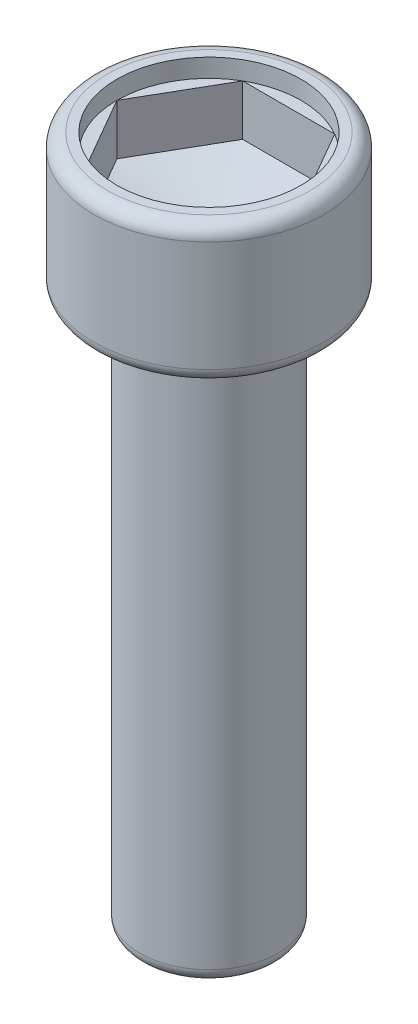
ISO-10303-21;
HEADER;
FILE_DESCRIPTION(('STEP AP214'),'2;1');
FILE_NAME('part.step','',(''),(''),'','','');
FILE_SCHEMA(('AUTOMOTIVE_DESIGN { 1 0 10303 214 1 1 1 1 }'));
ENDSEC;
DATA;
#1=APPLICATION_CONTEXT('core data for automotive mechanical design processes');
#2=APPLICATION_PROTOCOL_DEFINITION('international standard','automotive_design',2000,#1);
#3=PRODUCT_CONTEXT('',#1,'mechanical');
#4=PRODUCT('Part','Part','',(#3));
#5=PRODUCT_RELATED_PRODUCT_CATEGORY('part','',(#4));
#6=PRODUCT_DEFINITION_FORMATION('','',#4);
#7=PRODUCT_DEFINITION_CONTEXT('part definition',#1,'design');
#8=PRODUCT_DEFINITION('design','',#6,#7);
#9=PRODUCT_DEFINITION_SHAPE('','',#8);
#10=(LENGTH_UNIT() NAMED_UNIT(*) SI_UNIT(.MILLI.,.METRE.));
#11=(NAMED_UNIT(*) PLANE_ANGLE_UNIT() SI_UNIT($,.RADIAN.));
#12=(NAMED_UNIT(*) SI_UNIT($,.STERADIAN.) SOLID_ANGLE_UNIT());
#13=UNCERTAINTY_MEASURE_WITH_UNIT(LENGTH_MEASURE(1.E-05),#10,'distance_accuracy_value','');
#14=(GEOMETRIC_REPRESENTATION_CONTEXT(3) GLOBAL_UNCERTAINTY_ASSIGNED_CONTEXT((#13)) GLOBAL_UNIT_ASSIGNED_CONTEXT((#10,
#11,#12)) REPRESENTATION_CONTEXT('',''));
#15=CARTESIAN_POINT('',(0.,0.,0.));
#16=DIRECTION('',(0.,0.,1.));
#17=DIRECTION('',(1.,0.,0.));
#18=AXIS2_PLACEMENT_3D('',#15,#16,#17);
#19=CARTESIAN_POINT('',(0.,3.,0.));
#20=DIRECTION('',(0.,-1.,0.));
#21=DIRECTION('',(0.,0.,-1.));
#22=AXIS2_PLACEMENT_3D('',#19,#20,#21);
#23=CYLINDRICAL_SURFACE('',#22,2.5);
#24=CARTESIAN_POINT('',(0.,0.3,0.));
#25=DIRECTION('',(0.,1.,0.));
#26=DIRECTION('',(0.,0.,1.));
#27=AXIS2_PLACEMENT_3D('',#24,#25,#26);
#28=CIRCLE('',#27,2.5);
#29=CARTESIAN_POINT('',(0.,0.3,2.5));
#30=VERTEX_POINT('',#29);
#31=EDGE_CURVE('E188',#30,#30,#28,.T.);
#32=ORIENTED_EDGE('',*,*,#31,.T.);
#33=EDGE_LOOP('',(#32));
#34=FACE_BOUND('',#33,.T.);
#35=CARTESIAN_POINT('',(0.,2.7,0.));
#36=DIRECTION('',(0.,1.,0.));
#37=DIRECTION('',(0.,0.,1.));
#38=AXIS2_PLACEMENT_3D('',#35,#36,#37);
#39=CIRCLE('',#38,2.5);
#40=CARTESIAN_POINT('',(0.,2.7,2.5));
#41=VERTEX_POINT('',#40);
#42=EDGE_CURVE('E184',#41,#41,#39,.F.);
#43=ORIENTED_EDGE('',*,*,#42,.T.);
#44=EDGE_LOOP('',(#43));
#45=FACE_BOUND('',#44,.T.);
#46=ADVANCED_FACE('F50',(#34,#45),#23,.T.);
#47=CARTESIAN_POINT('',(0.,3.,0.));
#48=DIRECTION('',(0.,1.,0.));
#49=DIRECTION('',(0.,0.,1.));
#50=AXIS2_PLACEMENT_3D('',#47,#48,#49);
#51=PLANE('',#50);
#52=CARTESIAN_POINT('',(0.,3.,0.));
#53=DIRECTION('',(0.,1.,0.));
#54=DIRECTION('',(0.,0.,1.));
#55=AXIS2_PLACEMENT_3D('',#52,#53,#54);
#56=CIRCLE('',#55,2.2);
#57=CARTESIAN_POINT('',(0.,3.,2.2));
#58=VERTEX_POINT('',#57);
#59=EDGE_CURVE('E196',#58,#58,#56,.T.);
#60=ORIENTED_EDGE('',*,*,#59,.T.);
#61=EDGE_LOOP('',(#60));
#62=FACE_BOUND('',#61,.T.);
#63=CARTESIAN_POINT('',(0.,3.,0.));
#64=DIRECTION('',(0.,1.,0.));
#65=DIRECTION('',(0.,0.,1.));
#66=AXIS2_PLACEMENT_3D('',#63,#64,#65);
#67=CIRCLE('',#66,2.);
#68=CARTESIAN_POINT('',(0.,3.,2.));
#69=VERTEX_POINT('',#68);
#70=EDGE_CURVE('E122',#69,#69,#67,.T.);
#71=ORIENTED_EDGE('',*,*,#70,.F.);
#72=EDGE_LOOP('',(#71));
#73=FACE_BOUND('',#72,.T.);
#74=ADVANCED_FACE('F215',(#62,#73),#51,.T.);
#75=CARTESIAN_POINT('',(0.,0.,0.));
#76=DIRECTION('',(0.,1.,0.));
#77=DIRECTION('',(0.,0.,1.));
#78=AXIS2_PLACEMENT_3D('',#75,#76,#77);
#79=PLANE('',#78);
#80=CARTESIAN_POINT('',(0.,0.,0.));
#81=DIRECTION('',(0.,1.,0.));
#82=DIRECTION('',(0.,0.,1.));
#83=AXIS2_PLACEMENT_3D('',#80,#81,#82);
#84=CIRCLE('',#83,2.2);
#85=CARTESIAN_POINT('',(0.,0.,2.2));
#86=VERTEX_POINT('',#85);
#87=EDGE_CURVE('E192',#86,#86,#84,.F.);
#88=ORIENTED_EDGE('',*,*,#87,.T.);
#89=EDGE_LOOP('',(#88));
#90=FACE_BOUND('',#89,.T.);
#91=CARTESIAN_POINT('',(0.,0.,0.));
#92=DIRECTION('',(0.,-1.,0.));
#93=DIRECTION('',(0.,0.,-1.));
#94=AXIS2_PLACEMENT_3D('',#91,#92,#93);
#95=CIRCLE('',#94,1.5);
#96=CARTESIAN_POINT('',(0.,0.,-1.5));
#97=VERTEX_POINT('',#96);
#98=EDGE_CURVE('E183',#97,#97,#95,.T.);
#99=ORIENTED_EDGE('',*,*,#98,.F.);
#100=EDGE_LOOP('',(#99));
#101=FACE_BOUND('',#100,.T.);
#102=ADVANCED_FACE('F221',(#90,#101),#79,.F.);
#103=CARTESIAN_POINT('',(0.,2.6,0.));
#104=DIRECTION('',(0.,1.,0.));
#105=DIRECTION('',(0.,0.,1.));
#106=AXIS2_PLACEMENT_3D('',#103,#104,#105);
#107=CYLINDRICAL_SURFACE('',#106,2.);
#108=ORIENTED_EDGE('',*,*,#70,.T.);
#109=EDGE_LOOP('',(#108));
#110=FACE_BOUND('',#109,.T.);
#111=CARTESIAN_POINT('',(0.,2.6,0.));
#112=DIRECTION('',(0.,1.,0.));
#113=DIRECTION('',(0.,0.,1.));
#114=AXIS2_PLACEMENT_3D('',#111,#112,#113);
#115=CIRCLE('',#114,2.);
#116=CARTESIAN_POINT('',(-1.,2.6,1.73205080756888));
#117=VERTEX_POINT('',#116);
#118=CARTESIAN_POINT('',(0.999999999999999,2.6,1.73205080756888));
#119=VERTEX_POINT('',#118);
#120=EDGE_CURVE('E251',#117,#119,#115,.T.);
#121=ORIENTED_EDGE('',*,*,#120,.F.);
#122=CARTESIAN_POINT('',(-2.,2.6,0.));
#123=VERTEX_POINT('',#122);
#124=EDGE_CURVE('E279',#123,#117,#115,.T.);
#125=ORIENTED_EDGE('',*,*,#124,.F.);
#126=CARTESIAN_POINT('',(-0.999999999999998,2.6,-1.73205080756888));
#127=VERTEX_POINT('',#126);
#128=EDGE_CURVE('E294',#127,#123,#115,.T.);
#129=ORIENTED_EDGE('',*,*,#128,.F.);
#130=CARTESIAN_POINT('',(1.,2.6,-1.73205080756888));
#131=VERTEX_POINT('',#130);
#132=EDGE_CURVE('E301',#131,#127,#115,.T.);
#133=ORIENTED_EDGE('',*,*,#132,.F.);
#134=CARTESIAN_POINT('',(2.,2.6,0.));
#135=VERTEX_POINT('',#134);
#136=EDGE_CURVE('E65',#135,#131,#115,.T.);
#137=ORIENTED_EDGE('',*,*,#136,.F.);
#138=EDGE_CURVE('E246',#119,#135,#115,.T.);
#139=ORIENTED_EDGE('',*,*,#138,.F.);
#140=EDGE_LOOP('',(#121,#125,#129,#133,#137,#139));
#141=FACE_BOUND('',#140,.T.);
#142=ADVANCED_FACE('F239',(#110,#141),#107,.F.);
#143=CARTESIAN_POINT('',(0.,2.6,0.));
#144=DIRECTION('',(0.,1.,0.));
#145=DIRECTION('',(0.,0.,1.));
#146=AXIS2_PLACEMENT_3D('',#143,#144,#145);
#147=PLANE('',#146);
#148=DIRECTION('',(-0.5,0.,0.866025403784439));
#149=VECTOR('',#148,1.);
#150=CARTESIAN_POINT('',(1.,2.6,1.73205080756888));
#151=LINE('',#150,#149);
#152=EDGE_CURVE('E133',#135,#119,#151,.T.);
#153=ORIENTED_EDGE('',*,*,#152,.T.);
#154=ORIENTED_EDGE('',*,*,#138,.T.);
#155=EDGE_LOOP('',(#153,#154));
#156=FACE_BOUND('',#155,.T.);
#157=ADVANCED_FACE('F269',(#156),#147,.T.);
#158=DIRECTION('',(-1.,0.,0.));
#159=VECTOR('',#158,1.);
#160=CARTESIAN_POINT('',(-1.,2.6,1.73205080756888));
#161=LINE('',#160,#159);
#162=EDGE_CURVE('E264',#119,#117,#161,.T.);
#163=ORIENTED_EDGE('',*,*,#162,.T.);
#164=ORIENTED_EDGE('',*,*,#120,.T.);
#165=EDGE_LOOP('',(#163,#164));
#166=FACE_BOUND('',#165,.T.);
#167=ADVANCED_FACE('F273',(#166),#147,.T.);
#168=DIRECTION('',(-0.5,0.,-0.866025403784439));
#169=VECTOR('',#168,1.);
#170=CARTESIAN_POINT('',(-2.,2.6,0.));
#171=LINE('',#170,#169);
#172=EDGE_CURVE('E261',#117,#123,#171,.T.);
#173=ORIENTED_EDGE('',*,*,#172,.T.);
#174=ORIENTED_EDGE('',*,*,#124,.T.);
#175=EDGE_LOOP('',(#173,#174));
#176=FACE_BOUND('',#175,.T.);
#177=ADVANCED_FACE('F291',(#176),#147,.T.);
#178=DIRECTION('',(0.5,0.,-0.866025403784439));
#179=VECTOR('',#178,1.);
#180=CARTESIAN_POINT('',(-1.,2.6,-1.73205080756888));
#181=LINE('',#180,#179);
#182=EDGE_CURVE('E258',#123,#127,#181,.T.);
#183=ORIENTED_EDGE('',*,*,#182,.T.);
#184=ORIENTED_EDGE('',*,*,#128,.T.);
#185=EDGE_LOOP('',(#183,#184));
#186=FACE_BOUND('',#185,.T.);
#187=ADVANCED_FACE('F299',(#186),#147,.T.);
#188=DIRECTION('',(1.,0.,0.));
#189=VECTOR('',#188,1.);
#190=CARTESIAN_POINT('',(1.,2.6,-1.73205080756888));
#191=LINE('',#190,#189);
#192=EDGE_CURVE('E250',#127,#131,#191,.T.);
#193=ORIENTED_EDGE('',*,*,#192,.T.);
#194=ORIENTED_EDGE('',*,*,#132,.T.);
#195=EDGE_LOOP('',(#193,#194));
#196=FACE_BOUND('',#195,.T.);
#197=ADVANCED_FACE('F310',(#196),#147,.T.);
#198=DIRECTION('',(0.5,0.,0.866025403784439));
#199=VECTOR('',#198,1.);
#200=CARTESIAN_POINT('',(2.,2.6,0.));
#201=LINE('',#200,#199);
#202=EDGE_CURVE('E166',#131,#135,#201,.T.);
#203=ORIENTED_EDGE('',*,*,#202,.T.);
#204=ORIENTED_EDGE('',*,*,#136,.T.);
#205=EDGE_LOOP('',(#203,#204));
#206=FACE_BOUND('',#205,.T.);
#207=ADVANCED_FACE('F311',(#206),#147,.T.);
#208=CARTESIAN_POINT('',(2.,1.5,0.));
#209=DIRECTION('',(0.866025403784439,0.,-0.5));
#210=DIRECTION('',(-0.5,0.,-0.866025403784439));
#211=AXIS2_PLACEMENT_3D('',#208,#209,#210);
#212=PLANE('',#211);
#213=ORIENTED_EDGE('',*,*,#202,.F.);
#214=DIRECTION('',(0.,1.,0.));
#215=VECTOR('',#214,1.);
#216=CARTESIAN_POINT('',(1.,1.5,-1.73205080756888));
#217=LINE('',#216,#215);
#218=CARTESIAN_POINT('',(0.999999999999999,1.5,-1.73205080756888));
#219=VERTEX_POINT('',#218);
#220=EDGE_CURVE('E137',#219,#131,#217,.T.);
#221=ORIENTED_EDGE('',*,*,#220,.F.);
#222=DIRECTION('',(-0.5,0.,-0.866025403784439));
#223=VECTOR('',#222,1.);
#224=CARTESIAN_POINT('',(2.,1.5,0.));
#225=LINE('',#224,#223);
#226=CARTESIAN_POINT('',(2.,1.5,0.));
#227=VERTEX_POINT('',#226);
#228=EDGE_CURVE('E140',#227,#219,#225,.T.);
#229=ORIENTED_EDGE('',*,*,#228,.F.);
#230=DIRECTION('',(0.,1.,0.));
#231=VECTOR('',#230,1.);
#232=CARTESIAN_POINT('',(2.,1.5,0.));
#233=LINE('',#232,#231);
#234=EDGE_CURVE('E128',#227,#135,#233,.T.);
#235=ORIENTED_EDGE('',*,*,#234,.T.);
#236=EDGE_LOOP('',(#213,#221,#229,#235));
#237=FACE_BOUND('',#236,.T.);
#238=ADVANCED_FACE('F141',(#237),#212,.F.);
#239=CARTESIAN_POINT('',(1.,1.5,-1.73205080756888));
#240=DIRECTION('',(0.,0.,-1.));
#241=DIRECTION('',(-1.,0.,0.));
#242=AXIS2_PLACEMENT_3D('',#239,#240,#241);
#243=PLANE('',#242);
#244=ORIENTED_EDGE('',*,*,#192,.F.);
#245=DIRECTION('',(0.,1.,0.));
#246=VECTOR('',#245,1.);
#247=CARTESIAN_POINT('',(-1.,1.5,-1.73205080756888));
#248=LINE('',#247,#246);
#249=CARTESIAN_POINT('',(-1.,1.5,-1.73205080756888));
#250=VERTEX_POINT('',#249);
#251=EDGE_CURVE('E175',#250,#127,#248,.T.);
#252=ORIENTED_EDGE('',*,*,#251,.F.);
#253=DIRECTION('',(-1.,0.,0.));
#254=VECTOR('',#253,1.);
#255=CARTESIAN_POINT('',(1.,1.5,-1.73205080756888));
#256=LINE('',#255,#254);
#257=EDGE_CURVE('E147',#219,#250,#256,.T.);
#258=ORIENTED_EDGE('',*,*,#257,.F.);
#259=ORIENTED_EDGE('',*,*,#220,.T.);
#260=EDGE_LOOP('',(#244,#252,#258,#259));
#261=FACE_BOUND('',#260,.T.);
#262=ADVANCED_FACE('F308',(#261),#243,.F.);
#263=CARTESIAN_POINT('',(-1.,1.5,-1.73205080756888));
#264=DIRECTION('',(-0.866025403784439,0.,-0.5));
#265=DIRECTION('',(-0.5,0.,0.866025403784439));
#266=AXIS2_PLACEMENT_3D('',#263,#264,#265);
#267=PLANE('',#266);
#268=ORIENTED_EDGE('',*,*,#182,.F.);
#269=DIRECTION('',(0.,1.,0.));
#270=VECTOR('',#269,1.);
#271=CARTESIAN_POINT('',(-2.,1.5,0.));
#272=LINE('',#271,#270);
#273=CARTESIAN_POINT('',(-2.,1.5,0.));
#274=VERTEX_POINT('',#273);
#275=EDGE_CURVE('E171',#274,#123,#272,.T.);
#276=ORIENTED_EDGE('',*,*,#275,.F.);
#277=DIRECTION('',(-0.5,0.,0.866025403784439));
#278=VECTOR('',#277,1.);
#279=CARTESIAN_POINT('',(-1.,1.5,-1.73205080756888));
#280=LINE('',#279,#278);
#281=EDGE_CURVE('E151',#250,#274,#280,.T.);
#282=ORIENTED_EDGE('',*,*,#281,.F.);
#283=ORIENTED_EDGE('',*,*,#251,.T.);
#284=EDGE_LOOP('',(#268,#276,#282,#283));
#285=FACE_BOUND('',#284,.T.);
#286=ADVANCED_FACE('F303',(#285),#267,.F.);
#287=CARTESIAN_POINT('',(-2.,1.5,0.));
#288=DIRECTION('',(-0.866025403784439,0.,0.5));
#289=DIRECTION('',(0.5,0.,0.866025403784439));
#290=AXIS2_PLACEMENT_3D('',#287,#288,#289);
#291=PLANE('',#290);
#292=ORIENTED_EDGE('',*,*,#172,.F.);
#293=DIRECTION('',(0.,1.,0.));
#294=VECTOR('',#293,1.);
#295=CARTESIAN_POINT('',(-1.,1.5,1.73205080756888));
#296=LINE('',#295,#294);
#297=CARTESIAN_POINT('',(-1.,1.5,1.73205080756888));
#298=VERTEX_POINT('',#297);
#299=EDGE_CURVE('E167',#298,#117,#296,.T.);
#300=ORIENTED_EDGE('',*,*,#299,.F.);
#301=DIRECTION('',(0.5,0.,0.866025403784439));
#302=VECTOR('',#301,1.);
#303=CARTESIAN_POINT('',(-2.,1.5,0.));
#304=LINE('',#303,#302);
#305=EDGE_CURVE('E158',#274,#298,#304,.T.);
#306=ORIENTED_EDGE('',*,*,#305,.F.);
#307=ORIENTED_EDGE('',*,*,#275,.T.);
#308=EDGE_LOOP('',(#292,#300,#306,#307));
#309=FACE_BOUND('',#308,.T.);
#310=ADVANCED_FACE('F288',(#309),#291,.F.);
#311=CARTESIAN_POINT('',(-1.,1.5,1.73205080756888));
#312=DIRECTION('',(0.,0.,1.));
#313=DIRECTION('',(1.,0.,0.));
#314=AXIS2_PLACEMENT_3D('',#311,#312,#313);
#315=PLANE('',#314);
#316=ORIENTED_EDGE('',*,*,#162,.F.);
#317=DIRECTION('',(0.,1.,0.));
#318=VECTOR('',#317,1.);
#319=CARTESIAN_POINT('',(1.,1.5,1.73205080756888));
#320=LINE('',#319,#318);
#321=CARTESIAN_POINT('',(1.,1.5,1.73205080756888));
#322=VERTEX_POINT('',#321);
#323=EDGE_CURVE('E163',#322,#119,#320,.T.);
#324=ORIENTED_EDGE('',*,*,#323,.F.);
#325=DIRECTION('',(1.,0.,0.));
#326=VECTOR('',#325,1.);
#327=CARTESIAN_POINT('',(-1.,1.5,1.73205080756888));
#328=LINE('',#327,#326);
#329=EDGE_CURVE('E138',#298,#322,#328,.T.);
#330=ORIENTED_EDGE('',*,*,#329,.F.);
#331=ORIENTED_EDGE('',*,*,#299,.T.);
#332=EDGE_LOOP('',(#316,#324,#330,#331));
#333=FACE_BOUND('',#332,.T.);
#334=ADVANCED_FACE('F282',(#333),#315,.F.);
#335=CARTESIAN_POINT('',(1.,1.5,1.73205080756888));
#336=DIRECTION('',(0.866025403784439,0.,0.5));
#337=DIRECTION('',(0.5,0.,-0.866025403784439));
#338=AXIS2_PLACEMENT_3D('',#335,#336,#337);
#339=PLANE('',#338);
#340=ORIENTED_EDGE('',*,*,#152,.F.);
#341=ORIENTED_EDGE('',*,*,#234,.F.);
#342=DIRECTION('',(0.5,0.,-0.866025403784439));
#343=VECTOR('',#342,1.);
#344=CARTESIAN_POINT('',(1.,1.5,1.73205080756888));
#345=LINE('',#344,#343);
#346=EDGE_CURVE('E132',#322,#227,#345,.T.);
#347=ORIENTED_EDGE('',*,*,#346,.F.);
#348=ORIENTED_EDGE('',*,*,#323,.T.);
#349=EDGE_LOOP('',(#340,#341,#347,#348));
#350=FACE_BOUND('',#349,.T.);
#351=ADVANCED_FACE('F130',(#350),#339,.F.);
#352=CARTESIAN_POINT('',(0.,1.5,0.));
#353=DIRECTION('',(0.,1.,0.));
#354=DIRECTION('',(0.,0.,1.));
#355=AXIS2_PLACEMENT_3D('',#352,#353,#354);
#356=PLANE('',#355);
#357=CARTESIAN_POINT('',(0.,1.5,0.));
#358=DIRECTION('',(0.,1.,0.));
#359=DIRECTION('',(0.,0.,1.));
#360=AXIS2_PLACEMENT_3D('',#357,#358,#359);
#361=CIRCLE('',#360,2.);
#362=EDGE_CURVE('E115',#227,#219,#361,.T.);
#363=ORIENTED_EDGE('',*,*,#362,.F.);
#364=ORIENTED_EDGE('',*,*,#228,.T.);
#365=EDGE_LOOP('',(#363,#364));
#366=FACE_BOUND('',#365,.T.);
#367=ADVANCED_FACE('F338',(#366),#356,.F.);
#368=EDGE_CURVE('E369',#219,#250,#361,.T.);
#369=ORIENTED_EDGE('',*,*,#368,.F.);
#370=ORIENTED_EDGE('',*,*,#257,.T.);
#371=EDGE_LOOP('',(#369,#370));
#372=FACE_BOUND('',#371,.T.);
#373=ADVANCED_FACE('F342',(#372),#356,.F.);
#374=EDGE_CURVE('E366',#250,#274,#361,.T.);
#375=ORIENTED_EDGE('',*,*,#374,.F.);
#376=ORIENTED_EDGE('',*,*,#281,.T.);
#377=EDGE_LOOP('',(#375,#376));
#378=FACE_BOUND('',#377,.T.);
#379=ADVANCED_FACE('F347',(#378),#356,.F.);
#380=EDGE_CURVE('E362',#274,#298,#361,.T.);
#381=ORIENTED_EDGE('',*,*,#380,.F.);
#382=ORIENTED_EDGE('',*,*,#305,.T.);
#383=EDGE_LOOP('',(#381,#382));
#384=FACE_BOUND('',#383,.T.);
#385=ADVANCED_FACE('F355',(#384),#356,.F.);
#386=EDGE_CURVE('E119',#298,#322,#361,.T.);
#387=ORIENTED_EDGE('',*,*,#386,.F.);
#388=ORIENTED_EDGE('',*,*,#329,.T.);
#389=EDGE_LOOP('',(#387,#388));
#390=FACE_BOUND('',#389,.T.);
#391=ADVANCED_FACE('F351',(#390),#356,.F.);
#392=EDGE_CURVE('E72',#322,#227,#361,.T.);
#393=ORIENTED_EDGE('',*,*,#392,.F.);
#394=ORIENTED_EDGE('',*,*,#346,.T.);
#395=EDGE_LOOP('',(#393,#394));
#396=FACE_BOUND('',#395,.T.);
#397=ADVANCED_FACE('F109',(#396),#356,.F.);
#398=CARTESIAN_POINT('',(0.,1.5,0.));
#399=DIRECTION('',(0.,1.,0.));
#400=DIRECTION('',(0.,0.,1.));
#401=AXIS2_PLACEMENT_3D('',#398,#399,#400);
#402=CONICAL_SURFACE('',#401,2.,1.32645023151569);
#403=CARTESIAN_POINT('',(0.,1.00134399431364,0.));
#404=VERTEX_POINT('',#403);
#405=VERTEX_LOOP('',#404);
#406=FACE_BOUND('',#405,.T.);
#407=ORIENTED_EDGE('',*,*,#392,.T.);
#408=ORIENTED_EDGE('',*,*,#362,.T.);
#409=ORIENTED_EDGE('',*,*,#368,.T.);
#410=ORIENTED_EDGE('',*,*,#374,.T.);
#411=ORIENTED_EDGE('',*,*,#380,.T.);
#412=ORIENTED_EDGE('',*,*,#386,.T.);
#413=EDGE_LOOP('',(#407,#408,#409,#410,#411,#412));
#414=FACE_BOUND('',#413,.T.);
#415=ADVANCED_FACE('F105',(#406,#414),#402,.F.);
#416=CARTESIAN_POINT('',(0.,-12.,0.));
#417=DIRECTION('',(0.,1.,0.));
#418=DIRECTION('',(0.,0.,1.));
#419=AXIS2_PLACEMENT_3D('',#416,#417,#418);
#420=CYLINDRICAL_SURFACE('',#419,1.5);
#421=CARTESIAN_POINT('',(0.,-11.7,0.));
#422=DIRECTION('',(0.,-1.,0.));
#423=DIRECTION('',(0.,0.,-1.));
#424=AXIS2_PLACEMENT_3D('',#421,#422,#423);
#425=CIRCLE('',#424,1.5);
#426=CARTESIAN_POINT('',(0.,-11.7,-1.5));
#427=VERTEX_POINT('',#426);
#428=EDGE_CURVE('E11',#427,#427,#425,.F.);
#429=ORIENTED_EDGE('',*,*,#428,.T.);
#430=EDGE_LOOP('',(#429));
#431=FACE_BOUND('',#430,.T.);
#432=ORIENTED_EDGE('',*,*,#98,.T.);
#433=EDGE_LOOP('',(#432));
#434=FACE_BOUND('',#433,.T.);
#435=ADVANCED_FACE('F108',(#431,#434),#420,.T.);
#436=CARTESIAN_POINT('',(0.,-12.,0.));
#437=DIRECTION('',(0.,-1.,0.));
#438=DIRECTION('',(0.,0.,-1.));
#439=AXIS2_PLACEMENT_3D('',#436,#437,#438);
#440=PLANE('',#439);
#441=CARTESIAN_POINT('',(0.,-12.,0.));
#442=DIRECTION('',(0.,-1.,0.));
#443=DIRECTION('',(0.,0.,-1.));
#444=AXIS2_PLACEMENT_3D('',#441,#442,#443);
#445=CIRCLE('',#444,1.2);
#446=CARTESIAN_POINT('',(0.,-12.,-1.2));
#447=VERTEX_POINT('',#446);
#448=EDGE_CURVE('E59',#447,#447,#445,.T.);
#449=ORIENTED_EDGE('',*,*,#448,.T.);
#450=EDGE_LOOP('',(#449));
#451=FACE_BOUND('',#450,.T.);
#452=ADVANCED_FACE('F203',(#451),#440,.T.);
#453=CARTESIAN_POINT('',(0.,0.3,0.));
#454=DIRECTION('',(0.,1.,0.));
#455=DIRECTION('',(0.,0.,1.));
#456=AXIS2_PLACEMENT_3D('',#453,#454,#455);
#457=TOROIDAL_SURFACE('',#456,2.2,0.3);
#458=ORIENTED_EDGE('',*,*,#87,.F.);
#459=EDGE_LOOP('',(#458));
#460=FACE_BOUND('',#459,.T.);
#461=ORIENTED_EDGE('',*,*,#31,.F.);
#462=EDGE_LOOP('',(#461));
#463=FACE_BOUND('',#462,.T.);
#464=ADVANCED_FACE('F211',(#460,#463),#457,.T.);
#465=CARTESIAN_POINT('',(0.,2.7,0.));
#466=DIRECTION('',(0.,1.,0.));
#467=DIRECTION('',(0.,0.,1.));
#468=AXIS2_PLACEMENT_3D('',#465,#466,#467);
#469=TOROIDAL_SURFACE('',#468,2.2,0.3);
#470=ORIENTED_EDGE('',*,*,#42,.F.);
#471=EDGE_LOOP('',(#470));
#472=FACE_BOUND('',#471,.T.);
#473=ORIENTED_EDGE('',*,*,#59,.F.);
#474=EDGE_LOOP('',(#473));
#475=FACE_BOUND('',#474,.T.);
#476=ADVANCED_FACE('F206',(#472,#475),#469,.T.);
#477=CARTESIAN_POINT('',(0.,-11.7,0.));
#478=DIRECTION('',(0.,-1.,0.));
#479=DIRECTION('',(0.,0.,-1.));
#480=AXIS2_PLACEMENT_3D('',#477,#478,#479);
#481=TOROIDAL_SURFACE('',#480,1.2,0.3);
#482=ORIENTED_EDGE('',*,*,#428,.F.);
#483=EDGE_LOOP('',(#482));
#484=FACE_BOUND('',#483,.T.);
#485=ORIENTED_EDGE('',*,*,#448,.F.);
#486=EDGE_LOOP('',(#485));
#487=FACE_BOUND('',#486,.T.);
#488=ADVANCED_FACE('F52',(#484,#487),#481,.T.);
#489=CLOSED_SHELL('',(#46,#74,#102,#142,#157,#167,#177,#187,#197,#207,#238,#262,#286,#310,#334,
#351,#367,#373,#379,#385,#391,#397,#415,#435,#452,#464,#476,#488));
#490=MANIFOLD_SOLID_BREP('B2',#489);
#491=ADVANCED_BREP_SHAPE_REPRESENTATION('',(#18,#490),#14);
#492=SHAPE_DEFINITION_REPRESENTATION(#9,#491);
ENDSEC;
END-ISO-10303-21;
